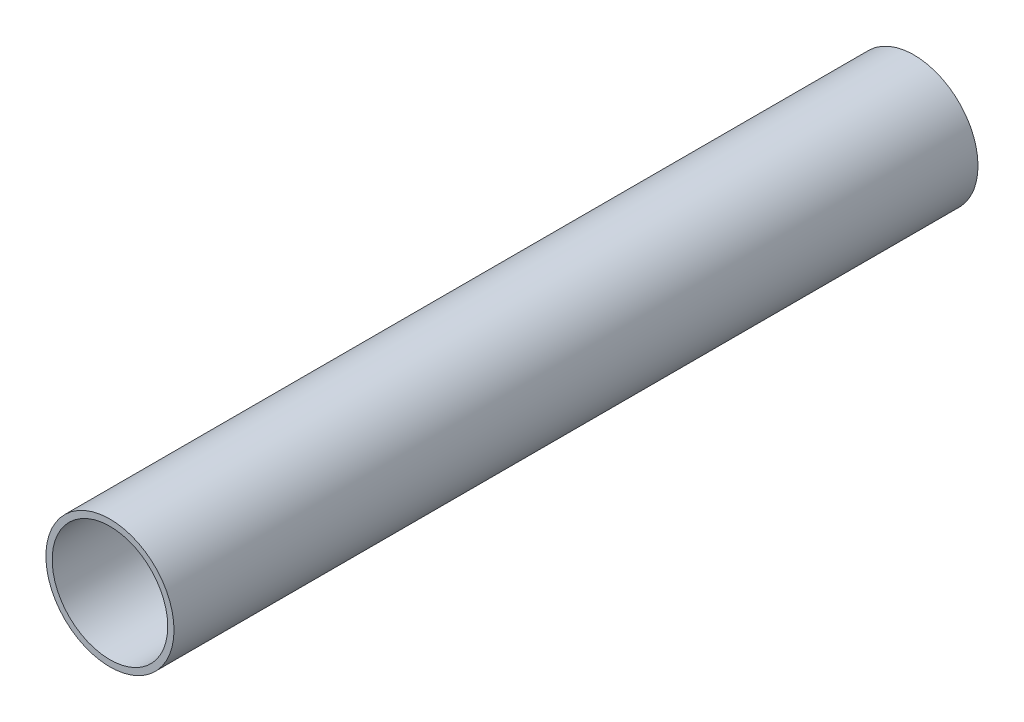
ISO-10303-21;
HEADER;
FILE_DESCRIPTION(('STEP AP214'),'2;1');
FILE_NAME('part.step','',(''),(''),'','','');
FILE_SCHEMA(('AUTOMOTIVE_DESIGN { 1 0 10303 214 1 1 1 1 }'));
ENDSEC;
DATA;
#1=APPLICATION_CONTEXT('core data for automotive mechanical design processes');
#2=APPLICATION_PROTOCOL_DEFINITION('international standard','automotive_design',2000,#1);
#3=PRODUCT_CONTEXT('',#1,'mechanical');
#4=PRODUCT('Part','Part','',(#3));
#5=PRODUCT_RELATED_PRODUCT_CATEGORY('part','',(#4));
#6=PRODUCT_DEFINITION_FORMATION('','',#4);
#7=PRODUCT_DEFINITION_CONTEXT('part definition',#1,'design');
#8=PRODUCT_DEFINITION('design','',#6,#7);
#9=PRODUCT_DEFINITION_SHAPE('','',#8);
#10=(LENGTH_UNIT() NAMED_UNIT(*) SI_UNIT(.MILLI.,.METRE.));
#11=(NAMED_UNIT(*) PLANE_ANGLE_UNIT() SI_UNIT($,.RADIAN.));
#12=(NAMED_UNIT(*) SI_UNIT($,.STERADIAN.) SOLID_ANGLE_UNIT());
#13=UNCERTAINTY_MEASURE_WITH_UNIT(LENGTH_MEASURE(1.E-05),#10,'distance_accuracy_value','');
#14=(GEOMETRIC_REPRESENTATION_CONTEXT(3) GLOBAL_UNCERTAINTY_ASSIGNED_CONTEXT((#13)) GLOBAL_UNIT_ASSIGNED_CONTEXT((#10,
#11,#12)) REPRESENTATION_CONTEXT('',''));
#15=CARTESIAN_POINT('',(0.,0.,0.));
#16=DIRECTION('',(0.,0.,1.));
#17=DIRECTION('',(1.,0.,0.));
#18=AXIS2_PLACEMENT_3D('',#15,#16,#17);
#19=CARTESIAN_POINT('',(0.,0.,160.));
#20=DIRECTION('',(0.,0.,1.));
#21=DIRECTION('',(1.,0.,0.));
#22=AXIS2_PLACEMENT_3D('',#19,#20,#21);
#23=PLANE('',#22);
#24=CARTESIAN_POINT('',(0.,0.,160.));
#25=DIRECTION('',(0.,0.,1.));
#26=DIRECTION('',(1.,0.,0.));
#27=AXIS2_PLACEMENT_3D('',#24,#25,#26);
#28=CIRCLE('',#27,12.75);
#29=CARTESIAN_POINT('',(12.75,0.,160.));
#30=VERTEX_POINT('',#29);
#31=EDGE_CURVE('E10',#30,#30,#28,.T.);
#32=ORIENTED_EDGE('',*,*,#31,.T.);
#33=EDGE_LOOP('',(#32));
#34=FACE_BOUND('',#33,.T.);
#35=CARTESIAN_POINT('',(0.,0.,160.));
#36=DIRECTION('',(0.,0.,1.));
#37=DIRECTION('',(1.,0.,0.));
#38=AXIS2_PLACEMENT_3D('',#35,#36,#37);
#39=CIRCLE('',#38,11.5);
#40=CARTESIAN_POINT('',(11.5,0.,160.));
#41=VERTEX_POINT('',#40);
#42=EDGE_CURVE('E48',#41,#41,#39,.T.);
#43=ORIENTED_EDGE('',*,*,#42,.F.);
#44=EDGE_LOOP('',(#43));
#45=FACE_BOUND('',#44,.T.);
#46=ADVANCED_FACE('F37',(#34,#45),#23,.T.);
#47=CARTESIAN_POINT('',(0.,0.,0.));
#48=DIRECTION('',(0.,0.,1.));
#49=DIRECTION('',(1.,0.,0.));
#50=AXIS2_PLACEMENT_3D('',#47,#48,#49);
#51=PLANE('',#50);
#52=CARTESIAN_POINT('',(0.,0.,0.));
#53=DIRECTION('',(0.,0.,1.));
#54=DIRECTION('',(1.,0.,0.));
#55=AXIS2_PLACEMENT_3D('',#52,#53,#54);
#56=CIRCLE('',#55,12.75);
#57=CARTESIAN_POINT('',(12.75,0.,0.));
#58=VERTEX_POINT('',#57);
#59=EDGE_CURVE('E41',#58,#58,#56,.T.);
#60=ORIENTED_EDGE('',*,*,#59,.F.);
#61=EDGE_LOOP('',(#60));
#62=FACE_BOUND('',#61,.T.);
#63=CARTESIAN_POINT('',(0.,0.,0.));
#64=DIRECTION('',(0.,0.,1.));
#65=DIRECTION('',(1.,0.,0.));
#66=AXIS2_PLACEMENT_3D('',#63,#64,#65);
#67=CIRCLE('',#66,11.5);
#68=CARTESIAN_POINT('',(11.5,0.,0.));
#69=VERTEX_POINT('',#68);
#70=EDGE_CURVE('E50',#69,#69,#67,.T.);
#71=ORIENTED_EDGE('',*,*,#70,.T.);
#72=EDGE_LOOP('',(#71));
#73=FACE_BOUND('',#72,.T.);
#74=ADVANCED_FACE('F60',(#62,#73),#51,.F.);
#75=CARTESIAN_POINT('',(0.,0.,160.));
#76=DIRECTION('',(0.,0.,-1.));
#77=DIRECTION('',(-1.,0.,0.));
#78=AXIS2_PLACEMENT_3D('',#75,#76,#77);
#79=CYLINDRICAL_SURFACE('',#78,12.75);
#80=ORIENTED_EDGE('',*,*,#31,.F.);
#81=EDGE_LOOP('',(#80));
#82=FACE_BOUND('',#81,.T.);
#83=ORIENTED_EDGE('',*,*,#59,.T.);
#84=EDGE_LOOP('',(#83));
#85=FACE_BOUND('',#84,.T.);
#86=ADVANCED_FACE('F39',(#82,#85),#79,.T.);
#87=CARTESIAN_POINT('',(0.,0.,160.));
#88=DIRECTION('',(0.,0.,-1.));
#89=DIRECTION('',(-1.,0.,0.));
#90=AXIS2_PLACEMENT_3D('',#87,#88,#89);
#91=CYLINDRICAL_SURFACE('',#90,11.5);
#92=ORIENTED_EDGE('',*,*,#42,.T.);
#93=EDGE_LOOP('',(#92));
#94=FACE_BOUND('',#93,.T.);
#95=ORIENTED_EDGE('',*,*,#70,.F.);
#96=EDGE_LOOP('',(#95));
#97=FACE_BOUND('',#96,.T.);
#98=ADVANCED_FACE('F56',(#94,#97),#91,.F.);
#99=CLOSED_SHELL('',(#46,#74,#86,#98));
#100=MANIFOLD_SOLID_BREP('B2',#99);
#101=ADVANCED_BREP_SHAPE_REPRESENTATION('',(#18,#100),#14);
#102=SHAPE_DEFINITION_REPRESENTATION(#9,#101);
ENDSEC;
END-ISO-10303-21;
